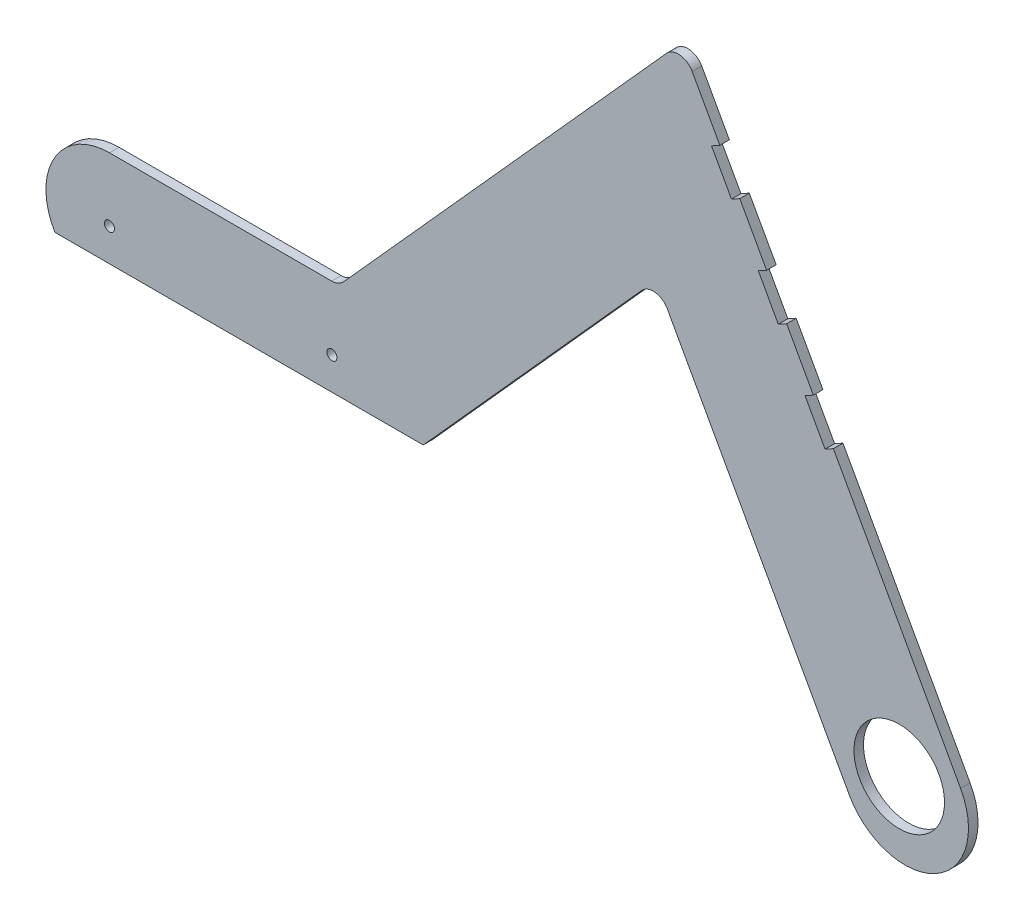
ISO-10303-21;
HEADER;
FILE_DESCRIPTION(('STEP AP214'),'2;1');
FILE_NAME('part.step','',(''),(''),'','','');
FILE_SCHEMA(('AUTOMOTIVE_DESIGN { 1 0 10303 214 1 1 1 1 }'));
ENDSEC;
DATA;
#1=APPLICATION_CONTEXT('core data for automotive mechanical design processes');
#2=APPLICATION_PROTOCOL_DEFINITION('international standard','automotive_design',2000,#1);
#3=PRODUCT_CONTEXT('',#1,'mechanical');
#4=PRODUCT('Part','Part','',(#3));
#5=PRODUCT_RELATED_PRODUCT_CATEGORY('part','',(#4));
#6=PRODUCT_DEFINITION_FORMATION('','',#4);
#7=PRODUCT_DEFINITION_CONTEXT('part definition',#1,'design');
#8=PRODUCT_DEFINITION('design','',#6,#7);
#9=PRODUCT_DEFINITION_SHAPE('','',#8);
#10=(LENGTH_UNIT() NAMED_UNIT(*) SI_UNIT(.MILLI.,.METRE.));
#11=(NAMED_UNIT(*) PLANE_ANGLE_UNIT() SI_UNIT($,.RADIAN.));
#12=(NAMED_UNIT(*) SI_UNIT($,.STERADIAN.) SOLID_ANGLE_UNIT());
#13=UNCERTAINTY_MEASURE_WITH_UNIT(LENGTH_MEASURE(1.E-05),#10,'distance_accuracy_value','');
#14=(GEOMETRIC_REPRESENTATION_CONTEXT(3) GLOBAL_UNCERTAINTY_ASSIGNED_CONTEXT((#13)) GLOBAL_UNIT_ASSIGNED_CONTEXT((#10,
#11,#12)) REPRESENTATION_CONTEXT('',''));
#15=CARTESIAN_POINT('',(0.,0.,0.));
#16=DIRECTION('',(0.,0.,1.));
#17=DIRECTION('',(1.,0.,0.));
#18=AXIS2_PLACEMENT_3D('',#15,#16,#17);
#19=CARTESIAN_POINT('',(47.5853332188057,145.502393907556,3.));
#20=DIRECTION('',(-0.875653678217041,-0.482939577820007,0.));
#21=DIRECTION('',(0.482939577820007,-0.875653678217041,0.));
#22=AXIS2_PLACEMENT_3D('',#19,#20,#21);
#23=PLANE('',#22);
#24=DIRECTION('',(-0.482939577820007,0.875653678217041,0.));
#25=VECTOR('',#24,1.);
#26=CARTESIAN_POINT('',(47.5853332188057,145.502393907556,3.));
#27=LINE('',#26,#25);
#28=CARTESIAN_POINT('',(56.2782456195659,129.740627699649,3.));
#29=VERTEX_POINT('',#28);
#30=CARTESIAN_POINT('',(47.5853332188057,145.502393907556,3.));
#31=VERTEX_POINT('',#30);
#32=EDGE_CURVE('E238',#29,#31,#27,.T.);
#33=ORIENTED_EDGE('',*,*,#32,.F.);
#34=DIRECTION('',(0.,0.,1.));
#35=VECTOR('',#34,1.);
#36=CARTESIAN_POINT('',(56.2782456195659,129.740627699649,3.));
#37=LINE('',#36,#35);
#38=CARTESIAN_POINT('',(56.2782456195659,129.740627699649,0.));
#39=VERTEX_POINT('',#38);
#40=EDGE_CURVE('E466',#39,#29,#37,.T.);
#41=ORIENTED_EDGE('',*,*,#40,.F.);
#42=DIRECTION('',(-0.482939577820007,0.875653678217041,0.));
#43=VECTOR('',#42,1.);
#44=CARTESIAN_POINT('',(47.5853332188057,145.502393907556,0.));
#45=LINE('',#44,#43);
#46=CARTESIAN_POINT('',(47.5853332188057,145.502393907556,0.));
#47=VERTEX_POINT('',#46);
#48=EDGE_CURVE('E274',#39,#47,#45,.T.);
#49=ORIENTED_EDGE('',*,*,#48,.T.);
#50=DIRECTION('',(0.,0.,-1.));
#51=VECTOR('',#50,1.);
#52=CARTESIAN_POINT('',(47.5853332188057,145.502393907556,3.));
#53=LINE('',#52,#51);
#54=EDGE_CURVE('E306',#31,#47,#53,.T.);
#55=ORIENTED_EDGE('',*,*,#54,.F.);
#56=EDGE_LOOP('',(#33,#41,#49,#55));
#57=FACE_BOUND('',#56,.T.);
#58=ADVANCED_FACE('F50',(#57),#23,.F.);
#59=CARTESIAN_POINT('',(70.9962652568578,103.054291306096,0.));
#60=VERTEX_POINT('',#59);
#61=CARTESIAN_POINT('',(62.5576471519857,118.354977607176,0.));
#62=VERTEX_POINT('',#61);
#63=EDGE_CURVE('E456',#60,#62,#45,.T.);
#64=ORIENTED_EDGE('',*,*,#63,.T.);
#65=DIRECTION('',(0.,0.,-1.));
#66=VECTOR('',#65,1.);
#67=CARTESIAN_POINT('',(62.5576471519857,118.354977607176,3.));
#68=LINE('',#67,#66);
#69=CARTESIAN_POINT('',(62.5576471519857,118.354977607176,3.));
#70=VERTEX_POINT('',#69);
#71=EDGE_CURVE('E527',#70,#62,#68,.T.);
#72=ORIENTED_EDGE('',*,*,#71,.F.);
#73=CARTESIAN_POINT('',(70.9962652568578,103.054291306096,3.));
#74=VERTEX_POINT('',#73);
#75=EDGE_CURVE('E484',#74,#70,#27,.T.);
#76=ORIENTED_EDGE('',*,*,#75,.F.);
#77=DIRECTION('',(0.,0.,1.));
#78=VECTOR('',#77,1.);
#79=CARTESIAN_POINT('',(70.9962652568578,103.054291306096,3.));
#80=LINE('',#79,#78);
#81=EDGE_CURVE('E513',#60,#74,#80,.T.);
#82=ORIENTED_EDGE('',*,*,#81,.F.);
#83=EDGE_LOOP('',(#64,#72,#76,#82));
#84=FACE_BOUND('',#83,.T.);
#85=ADVANCED_FACE('F421',(#84),#23,.F.);
#86=CARTESIAN_POINT('',(85.7142848941497,76.3679549125424,0.));
#87=VERTEX_POINT('',#86);
#88=CARTESIAN_POINT('',(77.2977547409545,91.628591905141,0.));
#89=VERTEX_POINT('',#88);
#90=EDGE_CURVE('E280',#87,#89,#45,.T.);
#91=ORIENTED_EDGE('',*,*,#90,.T.);
#92=DIRECTION('',(0.,0.,-1.));
#93=VECTOR('',#92,1.);
#94=CARTESIAN_POINT('',(77.2977547409545,91.628591905141,3.));
#95=LINE('',#94,#93);
#96=CARTESIAN_POINT('',(77.2977547409545,91.628591905141,3.));
#97=VERTEX_POINT('',#96);
#98=EDGE_CURVE('E451',#97,#89,#95,.T.);
#99=ORIENTED_EDGE('',*,*,#98,.F.);
#100=CARTESIAN_POINT('',(85.7142848941497,76.3679549125424,3.));
#101=VERTEX_POINT('',#100);
#102=EDGE_CURVE('E244',#101,#97,#27,.T.);
#103=ORIENTED_EDGE('',*,*,#102,.F.);
#104=DIRECTION('',(0.,0.,1.));
#105=VECTOR('',#104,1.);
#106=CARTESIAN_POINT('',(85.7142848941497,76.3679549125424,3.));
#107=LINE('',#106,#105);
#108=EDGE_CURVE('E352',#87,#101,#107,.T.);
#109=ORIENTED_EDGE('',*,*,#108,.F.);
#110=EDGE_LOOP('',(#91,#99,#103,#109));
#111=FACE_BOUND('',#110,.T.);
#112=ADVANCED_FACE('F427',(#111),#23,.F.);
#113=CARTESIAN_POINT('',(-135.81117841602,11.660861845859,3.));
#114=DIRECTION('',(0.,0.,-1.));
#115=DIRECTION('',(-1.,0.,0.));
#116=AXIS2_PLACEMENT_3D('',#113,#114,#115);
#117=PLANE('',#116);
#118=CARTESIAN_POINT('',(-135.81117841602,11.660861845859,3.));
#119=DIRECTION('',(0.,0.,1.));
#120=DIRECTION('',(-1.,0.,0.));
#121=AXIS2_PLACEMENT_3D('',#118,#119,#120);
#122=CIRCLE('',#121,20.);
#123=CARTESIAN_POINT('',(-135.81117841602,31.660861845859,3.));
#124=VERTEX_POINT('',#123);
#125=CARTESIAN_POINT('',(-152.975026866331,1.39429930649038,3.));
#126=VERTEX_POINT('',#125);
#127=EDGE_CURVE('E216',#124,#126,#122,.T.);
#128=ORIENTED_EDGE('',*,*,#127,.T.);
#129=DIRECTION('',(-1.,0.,0.));
#130=VECTOR('',#129,1.);
#131=CARTESIAN_POINT('',(-30.3553103678919,1.3942993064904,3.));
#132=LINE('',#131,#130);
#133=CARTESIAN_POINT('',(-37.0646348035132,1.39429930649038,3.));
#134=VERTEX_POINT('',#133);
#135=EDGE_CURVE('E204',#134,#126,#132,.T.);
#136=ORIENTED_EDGE('',*,*,#135,.F.);
#137=DIRECTION('',(0.668392450458517,0.743808800815141,0.));
#138=VECTOR('',#137,1.);
#139=CARTESIAN_POINT('',(31.6339667735705,77.8443316515208,3.));
#140=LINE('',#139,#138);
#141=CARTESIAN_POINT('',(31.6339667735705,77.8443316515208,3.));
#142=VERTEX_POINT('',#141);
#143=EDGE_CURVE('E213',#134,#142,#140,.T.);
#144=ORIENTED_EDGE('',*,*,#143,.T.);
#145=CARTESIAN_POINT('',(35.3530107776462,74.5023693992282,3.));
#146=DIRECTION('',(0.,0.,-1.));
#147=DIRECTION('',(1.,0.,0.));
#148=AXIS2_PLACEMENT_3D('',#145,#146,#147);
#149=CIRCLE('',#148,5.);
#150=CARTESIAN_POINT('',(39.7312791687314,76.9170672883282,3.));
#151=VERTEX_POINT('',#150);
#152=EDGE_CURVE('E223',#142,#151,#149,.T.);
#153=ORIENTED_EDGE('',*,*,#152,.T.);
#154=DIRECTION('',(0.482939577820007,-0.875653678217041,0.));
#155=VECTOR('',#154,1.);
#156=CARTESIAN_POINT('',(97.0169564632389,-26.9518561462004,3.));
#157=LINE('',#156,#155);
#158=CARTESIAN_POINT('',(97.0169564632389,-26.9518561462004,3.));
#159=VERTEX_POINT('',#158);
#160=EDGE_CURVE('E227',#151,#159,#157,.T.);
#161=ORIENTED_EDGE('',*,*,#160,.T.);
#162=CARTESIAN_POINT('',(114.53003002758,-17.2930645898003,3.));
#163=DIRECTION('',(0.,0.,1.));
#164=DIRECTION('',(-1.,0.,0.));
#165=AXIS2_PLACEMENT_3D('',#162,#163,#164);
#166=CIRCLE('',#165,20.);
#167=CARTESIAN_POINT('',(132.04310359192,-7.63427303340007,3.));
#168=VERTEX_POINT('',#167);
#169=EDGE_CURVE('E235',#159,#168,#166,.T.);
#170=ORIENTED_EDGE('',*,*,#169,.T.);
#171=CARTESIAN_POINT('',(92.0157743782464,64.9422555115878,3.));
#172=VERTEX_POINT('',#171);
#173=EDGE_CURVE('E239',#168,#172,#27,.T.);
#174=ORIENTED_EDGE('',*,*,#173,.T.);
#175=DIRECTION('',(0.875653678217041,0.482939577820007,0.));
#176=VECTOR('',#175,1.);
#177=CARTESIAN_POINT('',(89.3888133435953,63.4934367781278,3.));
#178=LINE('',#177,#176);
#179=CARTESIAN_POINT('',(89.3888133435953,63.4934367781278,3.));
#180=VERTEX_POINT('',#179);
#181=EDGE_CURVE('E343',#180,#172,#178,.T.);
#182=ORIENTED_EDGE('',*,*,#181,.F.);
#183=DIRECTION('',(0.482939577820007,-0.875653678217041,0.));
#184=VECTOR('',#183,1.);
#185=CARTESIAN_POINT('',(83.0873238594985,74.9191361790824,3.));
#186=LINE('',#185,#184);
#187=CARTESIAN_POINT('',(83.0873238594985,74.9191361790824,3.));
#188=VERTEX_POINT('',#187);
#189=EDGE_CURVE('E359',#188,#180,#186,.T.);
#190=ORIENTED_EDGE('',*,*,#189,.F.);
#191=DIRECTION('',(0.875653678217041,0.482939577820007,0.));
#192=VECTOR('',#191,1.);
#193=CARTESIAN_POINT('',(83.0873238594985,74.9191361790824,3.));
#194=LINE('',#193,#192);
#195=EDGE_CURVE('E493',#188,#101,#194,.T.);
#196=ORIENTED_EDGE('',*,*,#195,.T.);
#197=ORIENTED_EDGE('',*,*,#102,.T.);
#198=DIRECTION('',(0.875653678217041,0.482939577820007,0.));
#199=VECTOR('',#198,1.);
#200=CARTESIAN_POINT('',(74.6707937063034,90.179773171681,3.));
#201=LINE('',#200,#199);
#202=CARTESIAN_POINT('',(74.6707937063034,90.179773171681,3.));
#203=VERTEX_POINT('',#202);
#204=EDGE_CURVE('E492',#203,#97,#201,.T.);
#205=ORIENTED_EDGE('',*,*,#204,.F.);
#206=DIRECTION('',(0.482939577820007,-0.875653678217041,0.));
#207=VECTOR('',#206,1.);
#208=CARTESIAN_POINT('',(68.3693042222067,101.605472572636,3.));
#209=LINE('',#208,#207);
#210=CARTESIAN_POINT('',(68.3693042222067,101.605472572636,3.));
#211=VERTEX_POINT('',#210);
#212=EDGE_CURVE('E509',#211,#203,#209,.T.);
#213=ORIENTED_EDGE('',*,*,#212,.F.);
#214=DIRECTION('',(0.875653678217041,0.482939577820007,0.));
#215=VECTOR('',#214,1.);
#216=CARTESIAN_POINT('',(68.3693042222067,101.605472572636,3.));
#217=LINE('',#216,#215);
#218=EDGE_CURVE('E351',#211,#74,#217,.T.);
#219=ORIENTED_EDGE('',*,*,#218,.T.);
#220=ORIENTED_EDGE('',*,*,#75,.T.);
#221=DIRECTION('',(0.875653678217041,0.482939577820007,0.));
#222=VECTOR('',#221,1.);
#223=CARTESIAN_POINT('',(59.9306861173346,116.906158873716,3.));
#224=LINE('',#223,#222);
#225=CARTESIAN_POINT('',(59.9306861173346,116.906158873716,3.));
#226=VERTEX_POINT('',#225);
#227=EDGE_CURVE('E73',#226,#70,#224,.T.);
#228=ORIENTED_EDGE('',*,*,#227,.F.);
#229=DIRECTION('',(0.482939577820008,-0.875653678217041,0.));
#230=VECTOR('',#229,1.);
#231=CARTESIAN_POINT('',(53.6512845849147,128.291808966189,3.));
#232=LINE('',#231,#230);
#233=CARTESIAN_POINT('',(53.6512845849147,128.291808966189,3.));
#234=VERTEX_POINT('',#233);
#235=EDGE_CURVE('E551',#234,#226,#232,.T.);
#236=ORIENTED_EDGE('',*,*,#235,.F.);
#237=DIRECTION('',(0.875653678217041,0.482939577820007,0.));
#238=VECTOR('',#237,1.);
#239=CARTESIAN_POINT('',(53.6512845849147,128.291808966189,3.));
#240=LINE('',#239,#238);
#241=EDGE_CURVE('E386',#234,#29,#240,.T.);
#242=ORIENTED_EDGE('',*,*,#241,.T.);
#243=ORIENTED_EDGE('',*,*,#32,.T.);
#244=CARTESIAN_POINT('',(43.2070648277205,143.087696018456,3.));
#245=DIRECTION('',(0.,0.,1.));
#246=DIRECTION('',(1.,0.,0.));
#247=AXIS2_PLACEMENT_3D('',#244,#245,#246);
#248=CIRCLE('',#247,5.);
#249=CARTESIAN_POINT('',(39.4880208236448,146.429658270748,3.));
#250=VERTEX_POINT('',#249);
#251=EDGE_CURVE('E243',#31,#250,#248,.T.);
#252=ORIENTED_EDGE('',*,*,#251,.T.);
#253=DIRECTION('',(-0.668392450458517,-0.743808800815141,0.));
#254=VECTOR('',#253,1.);
#255=CARTESIAN_POINT('',(-62.1541983630746,33.3188995935664,3.));
#256=LINE('',#255,#254);
#257=CARTESIAN_POINT('',(-62.1541983630746,33.3188995935664,3.));
#258=VERTEX_POINT('',#257);
#259=EDGE_CURVE('E247',#250,#258,#256,.T.);
#260=ORIENTED_EDGE('',*,*,#259,.T.);
#261=CARTESIAN_POINT('',(-65.8732423671503,36.660861845859,3.));
#262=DIRECTION('',(0.,0.,-1.));
#263=DIRECTION('',(-1.,0.,0.));
#264=AXIS2_PLACEMENT_3D('',#261,#262,#263);
#265=CIRCLE('',#264,5.);
#266=CARTESIAN_POINT('',(-65.8732423671503,31.660861845859,3.));
#267=VERTEX_POINT('',#266);
#268=EDGE_CURVE('E250',#258,#267,#265,.T.);
#269=ORIENTED_EDGE('',*,*,#268,.T.);
#270=DIRECTION('',(-1.,0.,0.));
#271=VECTOR('',#270,1.);
#272=CARTESIAN_POINT('',(-135.81117841602,31.660861845859,3.));
#273=LINE('',#272,#271);
#274=EDGE_CURVE('E253',#267,#124,#273,.T.);
#275=ORIENTED_EDGE('',*,*,#274,.T.);
#276=EDGE_LOOP('',(#128,#136,#144,#153,#161,#170,#174,#182,#190,#196,#197,#205,#213,#219,#220,
#228,#236,#242,#243,#252,#260,#269,#275));
#277=FACE_BOUND('',#276,.T.);
#278=CARTESIAN_POINT('',(-135.81117841602,11.660861845859,3.));
#279=DIRECTION('',(0.,0.,1.));
#280=DIRECTION('',(1.,0.,0.));
#281=AXIS2_PLACEMENT_3D('',#278,#279,#280);
#282=CIRCLE('',#281,1.58);
#283=CARTESIAN_POINT('',(-134.23117841602,11.660861845859,3.));
#284=VERTEX_POINT('',#283);
#285=EDGE_CURVE('E262',#284,#284,#282,.T.);
#286=ORIENTED_EDGE('',*,*,#285,.F.);
#287=EDGE_LOOP('',(#286));
#288=FACE_BOUND('',#287,.T.);
#289=CARTESIAN_POINT('',(-65.8112157802054,11.5885363003127,3.));
#290=DIRECTION('',(0.,0.,1.));
#291=DIRECTION('',(1.,0.,0.));
#292=AXIS2_PLACEMENT_3D('',#289,#290,#291);
#293=CIRCLE('',#292,1.58);
#294=CARTESIAN_POINT('',(-64.2312157802054,11.5885363003127,3.));
#295=VERTEX_POINT('',#294);
#296=EDGE_CURVE('E387',#295,#295,#293,.T.);
#297=ORIENTED_EDGE('',*,*,#296,.F.);
#298=EDGE_LOOP('',(#297));
#299=FACE_BOUND('',#298,.T.);
#300=CARTESIAN_POINT('',(112.738617641013,-14.0449215144664,3.));
#301=DIRECTION('',(0.,0.,1.));
#302=DIRECTION('',(1.,0.,0.));
#303=AXIS2_PLACEMENT_3D('',#300,#301,#302);
#304=CIRCLE('',#303,14.25);
#305=CARTESIAN_POINT('',(126.988617641013,-14.0449215144664,3.));
#306=VERTEX_POINT('',#305);
#307=EDGE_CURVE('E377',#306,#306,#304,.T.);
#308=ORIENTED_EDGE('',*,*,#307,.F.);
#309=EDGE_LOOP('',(#308));
#310=FACE_BOUND('',#309,.T.);
#311=ADVANCED_FACE('F211',(#277,#288,#299,#310),#117,.F.);
#312=CARTESIAN_POINT('',(-135.81117841602,11.660861845859,0.));
#313=DIRECTION('',(0.,0.,-1.));
#314=DIRECTION('',(-1.,0.,0.));
#315=AXIS2_PLACEMENT_3D('',#312,#313,#314);
#316=PLANE('',#315);
#317=DIRECTION('',(1.,0.,0.));
#318=VECTOR('',#317,1.);
#319=CARTESIAN_POINT('',(-135.81117841602,1.39429930649038,0.));
#320=LINE('',#319,#318);
#321=CARTESIAN_POINT('',(-152.975026866331,1.39429930649038,0.));
#322=VERTEX_POINT('',#321);
#323=CARTESIAN_POINT('',(-37.0646348035132,1.39429930649039,0.));
#324=VERTEX_POINT('',#323);
#325=EDGE_CURVE('E66',#322,#324,#320,.T.);
#326=ORIENTED_EDGE('',*,*,#325,.F.);
#327=CARTESIAN_POINT('',(-135.81117841602,11.660861845859,0.));
#328=DIRECTION('',(0.,0.,1.));
#329=DIRECTION('',(-1.,0.,0.));
#330=AXIS2_PLACEMENT_3D('',#327,#328,#329);
#331=CIRCLE('',#330,20.);
#332=CARTESIAN_POINT('',(-135.81117841602,31.660861845859,0.));
#333=VERTEX_POINT('',#332);
#334=EDGE_CURVE('E257',#333,#322,#331,.T.);
#335=ORIENTED_EDGE('',*,*,#334,.F.);
#336=DIRECTION('',(-1.,0.,0.));
#337=VECTOR('',#336,1.);
#338=CARTESIAN_POINT('',(-135.81117841602,31.660861845859,0.));
#339=LINE('',#338,#337);
#340=CARTESIAN_POINT('',(-65.8732423671503,31.660861845859,0.));
#341=VERTEX_POINT('',#340);
#342=EDGE_CURVE('E229',#341,#333,#339,.T.);
#343=ORIENTED_EDGE('',*,*,#342,.F.);
#344=CARTESIAN_POINT('',(-65.8732423671503,36.660861845859,0.));
#345=DIRECTION('',(0.,0.,-1.));
#346=DIRECTION('',(-1.,0.,0.));
#347=AXIS2_PLACEMENT_3D('',#344,#345,#346);
#348=CIRCLE('',#347,5.);
#349=CARTESIAN_POINT('',(-62.1541983630746,33.3188995935664,0.));
#350=VERTEX_POINT('',#349);
#351=EDGE_CURVE('E286',#350,#341,#348,.T.);
#352=ORIENTED_EDGE('',*,*,#351,.F.);
#353=DIRECTION('',(-0.668392450458517,-0.743808800815141,0.));
#354=VECTOR('',#353,1.);
#355=CARTESIAN_POINT('',(-62.1541983630746,33.3188995935664,0.));
#356=LINE('',#355,#354);
#357=CARTESIAN_POINT('',(39.4880208236448,146.429658270748,0.));
#358=VERTEX_POINT('',#357);
#359=EDGE_CURVE('E283',#358,#350,#356,.T.);
#360=ORIENTED_EDGE('',*,*,#359,.F.);
#361=CARTESIAN_POINT('',(43.2070648277205,143.087696018456,0.));
#362=DIRECTION('',(0.,0.,1.));
#363=DIRECTION('',(1.,0.,0.));
#364=AXIS2_PLACEMENT_3D('',#361,#362,#363);
#365=CIRCLE('',#364,5.);
#366=EDGE_CURVE('E279',#47,#358,#365,.T.);
#367=ORIENTED_EDGE('',*,*,#366,.F.);
#368=ORIENTED_EDGE('',*,*,#48,.F.);
#369=DIRECTION('',(0.875653678217041,0.482939577820007,0.));
#370=VECTOR('',#369,1.);
#371=CARTESIAN_POINT('',(53.6512845849147,128.291808966189,0.));
#372=LINE('',#371,#370);
#373=CARTESIAN_POINT('',(53.6512845849147,128.291808966189,0.));
#374=VERTEX_POINT('',#373);
#375=EDGE_CURVE('E544',#374,#39,#372,.T.);
#376=ORIENTED_EDGE('',*,*,#375,.F.);
#377=DIRECTION('',(-0.482939577820008,0.875653678217041,0.));
#378=VECTOR('',#377,1.);
#379=CARTESIAN_POINT('',(53.6512845849147,128.291808966189,0.));
#380=LINE('',#379,#378);
#381=CARTESIAN_POINT('',(59.9306861173346,116.906158873716,0.));
#382=VERTEX_POINT('',#381);
#383=EDGE_CURVE('E557',#382,#374,#380,.T.);
#384=ORIENTED_EDGE('',*,*,#383,.F.);
#385=DIRECTION('',(0.875653678217041,0.482939577820007,0.));
#386=VECTOR('',#385,1.);
#387=CARTESIAN_POINT('',(59.9306861173346,116.906158873716,0.));
#388=LINE('',#387,#386);
#389=EDGE_CURVE('E539',#382,#62,#388,.T.);
#390=ORIENTED_EDGE('',*,*,#389,.T.);
#391=ORIENTED_EDGE('',*,*,#63,.F.);
#392=DIRECTION('',(0.875653678217041,0.482939577820007,0.));
#393=VECTOR('',#392,1.);
#394=CARTESIAN_POINT('',(68.3693042222067,101.605472572636,0.));
#395=LINE('',#394,#393);
#396=CARTESIAN_POINT('',(68.3693042222067,101.605472572636,0.));
#397=VERTEX_POINT('',#396);
#398=EDGE_CURVE('E357',#397,#60,#395,.T.);
#399=ORIENTED_EDGE('',*,*,#398,.F.);
#400=DIRECTION('',(-0.482939577820007,0.875653678217041,0.));
#401=VECTOR('',#400,1.);
#402=CARTESIAN_POINT('',(68.3693042222067,101.605472572636,0.));
#403=LINE('',#402,#401);
#404=CARTESIAN_POINT('',(74.6707937063034,90.179773171681,0.));
#405=VERTEX_POINT('',#404);
#406=EDGE_CURVE('E518',#405,#397,#403,.T.);
#407=ORIENTED_EDGE('',*,*,#406,.F.);
#408=DIRECTION('',(0.875653678217041,0.482939577820007,0.));
#409=VECTOR('',#408,1.);
#410=CARTESIAN_POINT('',(74.6707937063034,90.179773171681,0.));
#411=LINE('',#410,#409);
#412=EDGE_CURVE('E532',#405,#89,#411,.T.);
#413=ORIENTED_EDGE('',*,*,#412,.T.);
#414=ORIENTED_EDGE('',*,*,#90,.F.);
#415=DIRECTION('',(0.875653678217041,0.482939577820007,0.));
#416=VECTOR('',#415,1.);
#417=CARTESIAN_POINT('',(83.0873238594985,74.9191361790824,0.));
#418=LINE('',#417,#416);
#419=CARTESIAN_POINT('',(83.0873238594985,74.9191361790824,0.));
#420=VERTEX_POINT('',#419);
#421=EDGE_CURVE('E497',#420,#87,#418,.T.);
#422=ORIENTED_EDGE('',*,*,#421,.F.);
#423=DIRECTION('',(-0.482939577820007,0.875653678217041,0.));
#424=VECTOR('',#423,1.);
#425=CARTESIAN_POINT('',(83.0873238594985,74.9191361790824,0.));
#426=LINE('',#425,#424);
#427=CARTESIAN_POINT('',(89.3888133435953,63.4934367781278,0.));
#428=VERTEX_POINT('',#427);
#429=EDGE_CURVE('E367',#428,#420,#426,.T.);
#430=ORIENTED_EDGE('',*,*,#429,.F.);
#431=DIRECTION('',(0.875653678217041,0.482939577820007,0.));
#432=VECTOR('',#431,1.);
#433=CARTESIAN_POINT('',(89.3888133435953,63.4934367781278,0.));
#434=LINE('',#433,#432);
#435=CARTESIAN_POINT('',(92.0157743782464,64.9422555115878,0.));
#436=VERTEX_POINT('',#435);
#437=EDGE_CURVE('E501',#428,#436,#434,.T.);
#438=ORIENTED_EDGE('',*,*,#437,.T.);
#439=CARTESIAN_POINT('',(132.04310359192,-7.63427303340007,0.));
#440=VERTEX_POINT('',#439);
#441=EDGE_CURVE('E275',#440,#436,#45,.T.);
#442=ORIENTED_EDGE('',*,*,#441,.F.);
#443=CARTESIAN_POINT('',(114.53003002758,-17.2930645898003,0.));
#444=DIRECTION('',(0.,0.,1.));
#445=DIRECTION('',(-1.,0.,0.));
#446=AXIS2_PLACEMENT_3D('',#443,#444,#445);
#447=CIRCLE('',#446,20.);
#448=CARTESIAN_POINT('',(97.0169564632389,-26.9518561462004,0.));
#449=VERTEX_POINT('',#448);
#450=EDGE_CURVE('E271',#449,#440,#447,.T.);
#451=ORIENTED_EDGE('',*,*,#450,.F.);
#452=DIRECTION('',(0.482939577820007,-0.875653678217041,0.));
#453=VECTOR('',#452,1.);
#454=CARTESIAN_POINT('',(97.0169564632389,-26.9518561462004,0.));
#455=LINE('',#454,#453);
#456=CARTESIAN_POINT('',(39.7312791687314,76.9170672883282,0.));
#457=VERTEX_POINT('',#456);
#458=EDGE_CURVE('E268',#457,#449,#455,.T.);
#459=ORIENTED_EDGE('',*,*,#458,.F.);
#460=CARTESIAN_POINT('',(35.3530107776462,74.5023693992282,0.));
#461=DIRECTION('',(0.,0.,-1.));
#462=DIRECTION('',(1.,0.,0.));
#463=AXIS2_PLACEMENT_3D('',#460,#461,#462);
#464=CIRCLE('',#463,5.);
#465=CARTESIAN_POINT('',(31.6339667735705,77.8443316515208,0.));
#466=VERTEX_POINT('',#465);
#467=EDGE_CURVE('E265',#466,#457,#464,.T.);
#468=ORIENTED_EDGE('',*,*,#467,.F.);
#469=DIRECTION('',(0.668392450458517,0.743808800815141,0.));
#470=VECTOR('',#469,1.);
#471=CARTESIAN_POINT('',(31.6339667735705,77.8443316515208,0.));
#472=LINE('',#471,#470);
#473=EDGE_CURVE('E261',#324,#466,#472,.T.);
#474=ORIENTED_EDGE('',*,*,#473,.F.);
#475=EDGE_LOOP('',(#326,#335,#343,#352,#360,#367,#368,#376,#384,#390,#391,#399,#407,#413,#414,
#422,#430,#438,#442,#451,#459,#468,#474));
#476=FACE_BOUND('',#475,.T.);
#477=CARTESIAN_POINT('',(-65.8112157802054,11.5885363003127,0.));
#478=DIRECTION('',(0.,0.,1.));
#479=DIRECTION('',(1.,0.,0.));
#480=AXIS2_PLACEMENT_3D('',#477,#478,#479);
#481=CIRCLE('',#480,1.58);
#482=CARTESIAN_POINT('',(-64.2312157802054,11.5885363003127,0.));
#483=VERTEX_POINT('',#482);
#484=EDGE_CURVE('E381',#483,#483,#481,.T.);
#485=ORIENTED_EDGE('',*,*,#484,.T.);
#486=EDGE_LOOP('',(#485));
#487=FACE_BOUND('',#486,.T.);
#488=CARTESIAN_POINT('',(-135.81117841602,11.660861845859,0.));
#489=DIRECTION('',(0.,0.,1.));
#490=DIRECTION('',(1.,0.,0.));
#491=AXIS2_PLACEMENT_3D('',#488,#489,#490);
#492=CIRCLE('',#491,1.58);
#493=CARTESIAN_POINT('',(-134.23117841602,11.660861845859,0.));
#494=VERTEX_POINT('',#493);
#495=EDGE_CURVE('E391',#494,#494,#492,.T.);
#496=ORIENTED_EDGE('',*,*,#495,.T.);
#497=EDGE_LOOP('',(#496));
#498=FACE_BOUND('',#497,.T.);
#499=CARTESIAN_POINT('',(112.738617641013,-14.0449215144664,0.));
#500=DIRECTION('',(0.,0.,1.));
#501=DIRECTION('',(1.,0.,0.));
#502=AXIS2_PLACEMENT_3D('',#499,#500,#501);
#503=CIRCLE('',#502,14.25);
#504=CARTESIAN_POINT('',(126.988617641013,-14.0449215144664,0.));
#505=VERTEX_POINT('',#504);
#506=EDGE_CURVE('E382',#505,#505,#503,.T.);
#507=ORIENTED_EDGE('',*,*,#506,.T.);
#508=EDGE_LOOP('',(#507));
#509=FACE_BOUND('',#508,.T.);
#510=ADVANCED_FACE('F328',(#476,#487,#498,#509),#316,.T.);
#511=CARTESIAN_POINT('',(-135.81117841602,11.660861845859,3.));
#512=DIRECTION('',(0.,0.,-1.));
#513=DIRECTION('',(-1.,0.,0.));
#514=AXIS2_PLACEMENT_3D('',#511,#512,#513);
#515=CYLINDRICAL_SURFACE('',#514,20.);
#516=ORIENTED_EDGE('',*,*,#334,.T.);
#517=DIRECTION('',(0.,0.,-1.));
#518=VECTOR('',#517,1.);
#519=CARTESIAN_POINT('',(-152.975026866331,1.39429930649038,3.));
#520=LINE('',#519,#518);
#521=EDGE_CURVE('E498',#322,#126,#520,.F.);
#522=ORIENTED_EDGE('',*,*,#521,.T.);
#523=ORIENTED_EDGE('',*,*,#127,.F.);
#524=DIRECTION('',(0.,0.,-1.));
#525=VECTOR('',#524,1.);
#526=CARTESIAN_POINT('',(-135.81117841602,31.660861845859,3.));
#527=LINE('',#526,#525);
#528=EDGE_CURVE('E256',#124,#333,#527,.T.);
#529=ORIENTED_EDGE('',*,*,#528,.T.);
#530=EDGE_LOOP('',(#516,#522,#523,#529));
#531=FACE_BOUND('',#530,.T.);
#532=ADVANCED_FACE('F52',(#531),#515,.T.);
#533=CARTESIAN_POINT('',(31.6339667735705,77.8443316515208,3.));
#534=DIRECTION('',(-0.743808800815141,0.668392450458517,0.));
#535=DIRECTION('',(-0.668392450458517,-0.743808800815141,0.));
#536=AXIS2_PLACEMENT_3D('',#533,#534,#535);
#537=PLANE('',#536);
#538=ORIENTED_EDGE('',*,*,#143,.F.);
#539=DIRECTION('',(0.,0.,-1.));
#540=VECTOR('',#539,1.);
#541=CARTESIAN_POINT('',(-37.0646348035132,1.39429930649039,3.));
#542=LINE('',#541,#540);
#543=EDGE_CURVE('E11',#134,#324,#542,.T.);
#544=ORIENTED_EDGE('',*,*,#543,.T.);
#545=ORIENTED_EDGE('',*,*,#473,.T.);
#546=DIRECTION('',(0.,0.,-1.));
#547=VECTOR('',#546,1.);
#548=CARTESIAN_POINT('',(31.6339667735705,77.8443316515208,3.));
#549=LINE('',#548,#547);
#550=EDGE_CURVE('E59',#142,#466,#549,.T.);
#551=ORIENTED_EDGE('',*,*,#550,.F.);
#552=EDGE_LOOP('',(#538,#544,#545,#551));
#553=FACE_BOUND('',#552,.T.);
#554=ADVANCED_FACE('F219',(#553),#537,.F.);
#555=CARTESIAN_POINT('',(35.3530107776462,74.5023693992282,3.));
#556=DIRECTION('',(0.,0.,-1.));
#557=DIRECTION('',(-1.,0.,0.));
#558=AXIS2_PLACEMENT_3D('',#555,#556,#557);
#559=CYLINDRICAL_SURFACE('',#558,5.);
#560=ORIENTED_EDGE('',*,*,#467,.T.);
#561=DIRECTION('',(0.,0.,-1.));
#562=VECTOR('',#561,1.);
#563=CARTESIAN_POINT('',(39.7312791687314,76.9170672883282,3.));
#564=LINE('',#563,#562);
#565=EDGE_CURVE('E318',#151,#457,#564,.T.);
#566=ORIENTED_EDGE('',*,*,#565,.F.);
#567=ORIENTED_EDGE('',*,*,#152,.F.);
#568=ORIENTED_EDGE('',*,*,#550,.T.);
#569=EDGE_LOOP('',(#560,#566,#567,#568));
#570=FACE_BOUND('',#569,.T.);
#571=ADVANCED_FACE('F324',(#570),#559,.F.);
#572=CARTESIAN_POINT('',(97.0169564632389,-26.9518561462004,3.));
#573=DIRECTION('',(0.875653678217041,0.482939577820007,0.));
#574=DIRECTION('',(-0.482939577820007,0.875653678217041,0.));
#575=AXIS2_PLACEMENT_3D('',#572,#573,#574);
#576=PLANE('',#575);
#577=ORIENTED_EDGE('',*,*,#458,.T.);
#578=DIRECTION('',(0.,0.,-1.));
#579=VECTOR('',#578,1.);
#580=CARTESIAN_POINT('',(97.0169564632389,-26.9518561462004,3.));
#581=LINE('',#580,#579);
#582=EDGE_CURVE('E314',#159,#449,#581,.T.);
#583=ORIENTED_EDGE('',*,*,#582,.F.);
#584=ORIENTED_EDGE('',*,*,#160,.F.);
#585=ORIENTED_EDGE('',*,*,#565,.T.);
#586=EDGE_LOOP('',(#577,#583,#584,#585));
#587=FACE_BOUND('',#586,.T.);
#588=ADVANCED_FACE('F334',(#587),#576,.F.);
#589=CARTESIAN_POINT('',(114.53003002758,-17.2930645898003,3.));
#590=DIRECTION('',(0.,0.,-1.));
#591=DIRECTION('',(-1.,0.,0.));
#592=AXIS2_PLACEMENT_3D('',#589,#590,#591);
#593=CYLINDRICAL_SURFACE('',#592,20.);
#594=ORIENTED_EDGE('',*,*,#450,.T.);
#595=DIRECTION('',(0.,0.,-1.));
#596=VECTOR('',#595,1.);
#597=CARTESIAN_POINT('',(132.04310359192,-7.63427303340007,3.));
#598=LINE('',#597,#596);
#599=EDGE_CURVE('E310',#168,#440,#598,.T.);
#600=ORIENTED_EDGE('',*,*,#599,.F.);
#601=ORIENTED_EDGE('',*,*,#169,.F.);
#602=ORIENTED_EDGE('',*,*,#582,.T.);
#603=EDGE_LOOP('',(#594,#600,#601,#602));
#604=FACE_BOUND('',#603,.T.);
#605=ADVANCED_FACE('F338',(#604),#593,.T.);
#606=ORIENTED_EDGE('',*,*,#441,.T.);
#607=DIRECTION('',(0.,0.,-1.));
#608=VECTOR('',#607,1.);
#609=CARTESIAN_POINT('',(92.0157743782464,64.9422555115878,3.));
#610=LINE('',#609,#608);
#611=EDGE_CURVE('E347',#172,#436,#610,.T.);
#612=ORIENTED_EDGE('',*,*,#611,.F.);
#613=ORIENTED_EDGE('',*,*,#173,.F.);
#614=ORIENTED_EDGE('',*,*,#599,.T.);
#615=EDGE_LOOP('',(#606,#612,#613,#614));
#616=FACE_BOUND('',#615,.T.);
#617=ADVANCED_FACE('F346',(#616),#23,.F.);
#618=CARTESIAN_POINT('',(43.2070648277205,143.087696018456,3.));
#619=DIRECTION('',(0.,0.,-1.));
#620=DIRECTION('',(-1.,0.,0.));
#621=AXIS2_PLACEMENT_3D('',#618,#619,#620);
#622=CYLINDRICAL_SURFACE('',#621,5.);
#623=ORIENTED_EDGE('',*,*,#366,.T.);
#624=DIRECTION('',(0.,0.,-1.));
#625=VECTOR('',#624,1.);
#626=CARTESIAN_POINT('',(39.4880208236448,146.429658270748,3.));
#627=LINE('',#626,#625);
#628=EDGE_CURVE('E302',#250,#358,#627,.T.);
#629=ORIENTED_EDGE('',*,*,#628,.F.);
#630=ORIENTED_EDGE('',*,*,#251,.F.);
#631=ORIENTED_EDGE('',*,*,#54,.T.);
#632=EDGE_LOOP('',(#623,#629,#630,#631));
#633=FACE_BOUND('',#632,.T.);
#634=ADVANCED_FACE('F433',(#633),#622,.T.);
#635=CARTESIAN_POINT('',(-62.1541983630746,33.3188995935664,3.));
#636=DIRECTION('',(0.743808800815141,-0.668392450458517,0.));
#637=DIRECTION('',(0.668392450458517,0.743808800815141,0.));
#638=AXIS2_PLACEMENT_3D('',#635,#636,#637);
#639=PLANE('',#638);
#640=ORIENTED_EDGE('',*,*,#359,.T.);
#641=DIRECTION('',(0.,0.,-1.));
#642=VECTOR('',#641,1.);
#643=CARTESIAN_POINT('',(-62.1541983630746,33.3188995935664,3.));
#644=LINE('',#643,#642);
#645=EDGE_CURVE('E298',#258,#350,#644,.T.);
#646=ORIENTED_EDGE('',*,*,#645,.F.);
#647=ORIENTED_EDGE('',*,*,#259,.F.);
#648=ORIENTED_EDGE('',*,*,#628,.T.);
#649=EDGE_LOOP('',(#640,#646,#647,#648));
#650=FACE_BOUND('',#649,.T.);
#651=ADVANCED_FACE('F438',(#650),#639,.F.);
#652=CARTESIAN_POINT('',(-65.8732423671503,36.660861845859,3.));
#653=DIRECTION('',(0.,0.,-1.));
#654=DIRECTION('',(-1.,0.,0.));
#655=AXIS2_PLACEMENT_3D('',#652,#653,#654);
#656=CYLINDRICAL_SURFACE('',#655,5.);
#657=ORIENTED_EDGE('',*,*,#351,.T.);
#658=DIRECTION('',(0.,0.,-1.));
#659=VECTOR('',#658,1.);
#660=CARTESIAN_POINT('',(-65.8732423671503,31.660861845859,3.));
#661=LINE('',#660,#659);
#662=EDGE_CURVE('E294',#267,#341,#661,.T.);
#663=ORIENTED_EDGE('',*,*,#662,.F.);
#664=ORIENTED_EDGE('',*,*,#268,.F.);
#665=ORIENTED_EDGE('',*,*,#645,.T.);
#666=EDGE_LOOP('',(#657,#663,#664,#665));
#667=FACE_BOUND('',#666,.T.);
#668=ADVANCED_FACE('F416',(#667),#656,.F.);
#669=CARTESIAN_POINT('',(-135.81117841602,31.660861845859,3.));
#670=DIRECTION('',(0.,-1.,0.));
#671=DIRECTION('',(0.,0.,-1.));
#672=AXIS2_PLACEMENT_3D('',#669,#670,#671);
#673=PLANE('',#672);
#674=ORIENTED_EDGE('',*,*,#342,.T.);
#675=ORIENTED_EDGE('',*,*,#528,.F.);
#676=ORIENTED_EDGE('',*,*,#274,.F.);
#677=ORIENTED_EDGE('',*,*,#662,.T.);
#678=EDGE_LOOP('',(#674,#675,#676,#677));
#679=FACE_BOUND('',#678,.T.);
#680=ADVANCED_FACE('F406',(#679),#673,.F.);
#681=CARTESIAN_POINT('',(-135.81117841602,11.660861845859,3.));
#682=DIRECTION('',(0.,0.,-1.));
#683=DIRECTION('',(-1.,0.,0.));
#684=AXIS2_PLACEMENT_3D('',#681,#682,#683);
#685=CYLINDRICAL_SURFACE('',#684,1.58);
#686=ORIENTED_EDGE('',*,*,#285,.T.);
#687=EDGE_LOOP('',(#686));
#688=FACE_BOUND('',#687,.T.);
#689=ORIENTED_EDGE('',*,*,#495,.F.);
#690=EDGE_LOOP('',(#689));
#691=FACE_BOUND('',#690,.T.);
#692=ADVANCED_FACE('F403',(#688,#691),#685,.F.);
#693=CARTESIAN_POINT('',(-65.8112157802054,11.5885363003127,3.));
#694=DIRECTION('',(0.,0.,-1.));
#695=DIRECTION('',(-1.,0.,0.));
#696=AXIS2_PLACEMENT_3D('',#693,#694,#695);
#697=CYLINDRICAL_SURFACE('',#696,1.58);
#698=ORIENTED_EDGE('',*,*,#296,.T.);
#699=EDGE_LOOP('',(#698));
#700=FACE_BOUND('',#699,.T.);
#701=ORIENTED_EDGE('',*,*,#484,.F.);
#702=EDGE_LOOP('',(#701));
#703=FACE_BOUND('',#702,.T.);
#704=ADVANCED_FACE('F405',(#700,#703),#697,.F.);
#705=CARTESIAN_POINT('',(112.738617641013,-14.0449215144664,3.));
#706=DIRECTION('',(0.,0.,-1.));
#707=DIRECTION('',(-1.,0.,0.));
#708=AXIS2_PLACEMENT_3D('',#705,#706,#707);
#709=CYLINDRICAL_SURFACE('',#708,14.25);
#710=ORIENTED_EDGE('',*,*,#307,.T.);
#711=EDGE_LOOP('',(#710));
#712=FACE_BOUND('',#711,.T.);
#713=ORIENTED_EDGE('',*,*,#506,.F.);
#714=EDGE_LOOP('',(#713));
#715=FACE_BOUND('',#714,.T.);
#716=ADVANCED_FACE('F413',(#712,#715),#709,.F.);
#717=CARTESIAN_POINT('',(83.0873238594985,74.9191361790824,3.));
#718=DIRECTION('',(-0.482939577820007,0.875653678217041,0.));
#719=DIRECTION('',(-0.875653678217041,-0.482939577820008,0.));
#720=AXIS2_PLACEMENT_3D('',#717,#718,#719);
#721=PLANE('',#720);
#722=ORIENTED_EDGE('',*,*,#108,.T.);
#723=ORIENTED_EDGE('',*,*,#195,.F.);
#724=DIRECTION('',(0.,0.,1.));
#725=VECTOR('',#724,1.);
#726=CARTESIAN_POINT('',(83.0873238594985,74.9191361790824,3.));
#727=LINE('',#726,#725);
#728=EDGE_CURVE('E363',#420,#188,#727,.T.);
#729=ORIENTED_EDGE('',*,*,#728,.F.);
#730=ORIENTED_EDGE('',*,*,#421,.T.);
#731=EDGE_LOOP('',(#722,#723,#729,#730));
#732=FACE_BOUND('',#731,.T.);
#733=ADVANCED_FACE('F599',(#732),#721,.F.);
#734=CARTESIAN_POINT('',(89.3888133435953,63.4934367781278,3.));
#735=DIRECTION('',(0.482939577820007,-0.875653678217041,0.));
#736=DIRECTION('',(0.875653678217041,0.482939577820008,0.));
#737=AXIS2_PLACEMENT_3D('',#734,#735,#736);
#738=PLANE('',#737);
#739=ORIENTED_EDGE('',*,*,#611,.T.);
#740=ORIENTED_EDGE('',*,*,#437,.F.);
#741=DIRECTION('',(0.,0.,-1.));
#742=VECTOR('',#741,1.);
#743=CARTESIAN_POINT('',(89.3888133435953,63.4934367781278,3.));
#744=LINE('',#743,#742);
#745=EDGE_CURVE('E370',#180,#428,#744,.T.);
#746=ORIENTED_EDGE('',*,*,#745,.F.);
#747=ORIENTED_EDGE('',*,*,#181,.T.);
#748=EDGE_LOOP('',(#739,#740,#746,#747));
#749=FACE_BOUND('',#748,.T.);
#750=ADVANCED_FACE('F596',(#749),#738,.F.);
#751=CARTESIAN_POINT('',(95.3912044875967,52.6100548298769,0.));
#752=DIRECTION('',(0.875653678217041,0.482939577820007,0.));
#753=DIRECTION('',(-0.482939577820007,0.875653678217041,0.));
#754=AXIS2_PLACEMENT_3D('',#751,#752,#753);
#755=PLANE('',#754);
#756=ORIENTED_EDGE('',*,*,#189,.T.);
#757=ORIENTED_EDGE('',*,*,#745,.T.);
#758=ORIENTED_EDGE('',*,*,#429,.T.);
#759=ORIENTED_EDGE('',*,*,#728,.T.);
#760=EDGE_LOOP('',(#756,#757,#758,#759));
#761=FACE_BOUND('',#760,.T.);
#762=ADVANCED_FACE('F591',(#761),#755,.T.);
#763=CARTESIAN_POINT('',(68.3693042222067,101.605472572636,3.));
#764=DIRECTION('',(-0.482939577820007,0.875653678217041,0.));
#765=DIRECTION('',(-0.875653678217041,-0.482939577820008,0.));
#766=AXIS2_PLACEMENT_3D('',#763,#764,#765);
#767=PLANE('',#766);
#768=ORIENTED_EDGE('',*,*,#81,.T.);
#769=ORIENTED_EDGE('',*,*,#218,.F.);
#770=DIRECTION('',(0.,0.,1.));
#771=VECTOR('',#770,1.);
#772=CARTESIAN_POINT('',(68.3693042222067,101.605472572636,3.));
#773=LINE('',#772,#771);
#774=EDGE_CURVE('E521',#397,#211,#773,.T.);
#775=ORIENTED_EDGE('',*,*,#774,.F.);
#776=ORIENTED_EDGE('',*,*,#398,.T.);
#777=EDGE_LOOP('',(#768,#769,#775,#776));
#778=FACE_BOUND('',#777,.T.);
#779=ADVANCED_FACE('F577',(#778),#767,.F.);
#780=CARTESIAN_POINT('',(74.6707937063034,90.179773171681,3.));
#781=DIRECTION('',(0.482939577820007,-0.875653678217041,0.));
#782=DIRECTION('',(0.875653678217041,0.482939577820008,0.));
#783=AXIS2_PLACEMENT_3D('',#780,#781,#782);
#784=PLANE('',#783);
#785=ORIENTED_EDGE('',*,*,#98,.T.);
#786=ORIENTED_EDGE('',*,*,#412,.F.);
#787=DIRECTION('',(0.,0.,-1.));
#788=VECTOR('',#787,1.);
#789=CARTESIAN_POINT('',(74.6707937063034,90.179773171681,3.));
#790=LINE('',#789,#788);
#791=EDGE_CURVE('E514',#203,#405,#790,.T.);
#792=ORIENTED_EDGE('',*,*,#791,.F.);
#793=ORIENTED_EDGE('',*,*,#204,.T.);
#794=EDGE_LOOP('',(#785,#786,#792,#793));
#795=FACE_BOUND('',#794,.T.);
#796=ADVANCED_FACE('F583',(#795),#784,.F.);
#797=CARTESIAN_POINT('',(95.3912044875967,52.6100548298769,0.));
#798=DIRECTION('',(0.875653678217041,0.482939577820007,0.));
#799=DIRECTION('',(-0.482939577820007,0.875653678217041,0.));
#800=AXIS2_PLACEMENT_3D('',#797,#798,#799);
#801=PLANE('',#800);
#802=ORIENTED_EDGE('',*,*,#212,.T.);
#803=ORIENTED_EDGE('',*,*,#791,.T.);
#804=ORIENTED_EDGE('',*,*,#406,.T.);
#805=ORIENTED_EDGE('',*,*,#774,.T.);
#806=EDGE_LOOP('',(#802,#803,#804,#805));
#807=FACE_BOUND('',#806,.T.);
#808=ADVANCED_FACE('F580',(#807),#801,.T.);
#809=CARTESIAN_POINT('',(53.6512845849147,128.291808966189,3.));
#810=DIRECTION('',(-0.482939577820007,0.875653678217041,0.));
#811=DIRECTION('',(-0.875653678217041,-0.482939577820008,0.));
#812=AXIS2_PLACEMENT_3D('',#809,#810,#811);
#813=PLANE('',#812);
#814=ORIENTED_EDGE('',*,*,#40,.T.);
#815=ORIENTED_EDGE('',*,*,#241,.F.);
#816=DIRECTION('',(0.,0.,1.));
#817=VECTOR('',#816,1.);
#818=CARTESIAN_POINT('',(53.6512845849147,128.291808966189,3.));
#819=LINE('',#818,#817);
#820=EDGE_CURVE('E540',#374,#234,#819,.T.);
#821=ORIENTED_EDGE('',*,*,#820,.F.);
#822=ORIENTED_EDGE('',*,*,#375,.T.);
#823=EDGE_LOOP('',(#814,#815,#821,#822));
#824=FACE_BOUND('',#823,.T.);
#825=ADVANCED_FACE('F573',(#824),#813,.F.);
#826=CARTESIAN_POINT('',(59.9306861173346,116.906158873716,3.));
#827=DIRECTION('',(0.482939577820007,-0.875653678217041,0.));
#828=DIRECTION('',(0.875653678217041,0.482939577820008,0.));
#829=AXIS2_PLACEMENT_3D('',#826,#827,#828);
#830=PLANE('',#829);
#831=ORIENTED_EDGE('',*,*,#71,.T.);
#832=ORIENTED_EDGE('',*,*,#389,.F.);
#833=DIRECTION('',(0.,0.,-1.));
#834=VECTOR('',#833,1.);
#835=CARTESIAN_POINT('',(59.9306861173346,116.906158873716,3.));
#836=LINE('',#835,#834);
#837=EDGE_CURVE('E560',#226,#382,#836,.T.);
#838=ORIENTED_EDGE('',*,*,#837,.F.);
#839=ORIENTED_EDGE('',*,*,#227,.T.);
#840=EDGE_LOOP('',(#831,#832,#838,#839));
#841=FACE_BOUND('',#840,.T.);
#842=ADVANCED_FACE('F575',(#841),#830,.F.);
#843=CARTESIAN_POINT('',(95.3912044875967,52.610054829877,0.));
#844=DIRECTION('',(0.875653678217041,0.482939577820008,0.));
#845=DIRECTION('',(-0.482939577820008,0.875653678217041,0.));
#846=AXIS2_PLACEMENT_3D('',#843,#844,#845);
#847=PLANE('',#846);
#848=ORIENTED_EDGE('',*,*,#235,.T.);
#849=ORIENTED_EDGE('',*,*,#837,.T.);
#850=ORIENTED_EDGE('',*,*,#383,.T.);
#851=ORIENTED_EDGE('',*,*,#820,.T.);
#852=EDGE_LOOP('',(#848,#849,#850,#851));
#853=FACE_BOUND('',#852,.T.);
#854=ADVANCED_FACE('F569',(#853),#847,.T.);
#855=CARTESIAN_POINT('',(-30.3553103678919,1.3942993064904,-7.));
#856=DIRECTION('',(0.,1.,0.));
#857=DIRECTION('',(-1.,0.,0.));
#858=AXIS2_PLACEMENT_3D('',#855,#856,#857);
#859=PLANE('',#858);
#860=ORIENTED_EDGE('',*,*,#325,.T.);
#861=ORIENTED_EDGE('',*,*,#543,.F.);
#862=ORIENTED_EDGE('',*,*,#135,.T.);
#863=ORIENTED_EDGE('',*,*,#521,.F.);
#864=EDGE_LOOP('',(#860,#861,#862,#863));
#865=FACE_BOUND('',#864,.T.);
#866=ADVANCED_FACE('F203',(#865),#859,.F.);
#867=CLOSED_SHELL('',(#58,#85,#112,#311,#510,#532,#554,#571,#588,#605,#617,#634,#651,#668,#680,
#692,#704,#716,#733,#750,#762,#779,#796,#808,#825,#842,#854,#866));
#868=MANIFOLD_SOLID_BREP('B2',#867);
#869=ADVANCED_BREP_SHAPE_REPRESENTATION('',(#18,#868),#14);
#870=SHAPE_DEFINITION_REPRESENTATION(#9,#869);
ENDSEC;
END-ISO-10303-21;
